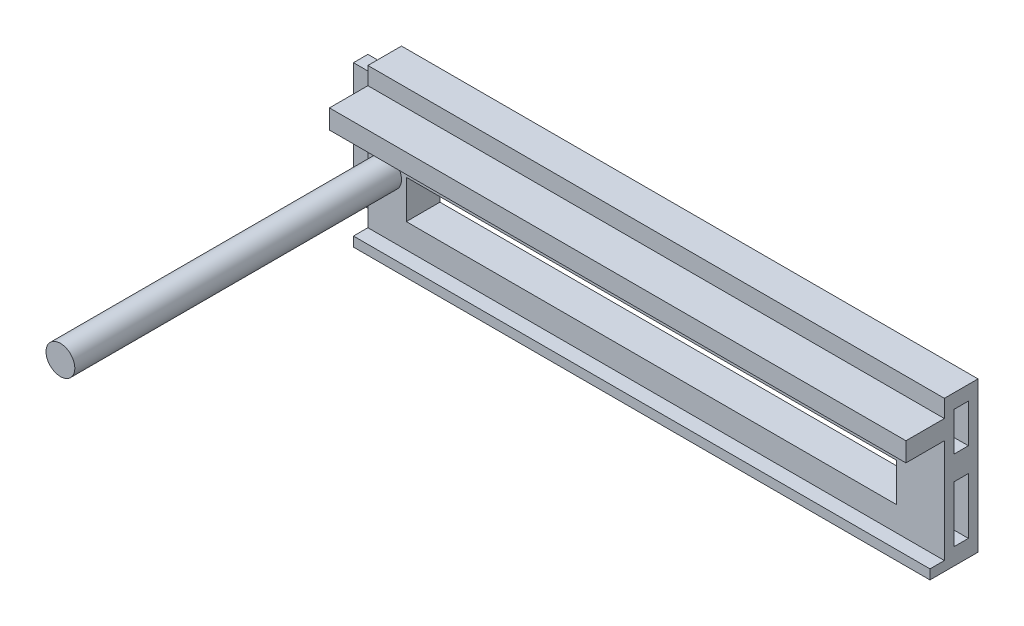
ISO-10303-21;
HEADER;
FILE_DESCRIPTION(('STEP AP214'),'2;1');
FILE_NAME('part.step','',(''),(''),'','','');
FILE_SCHEMA(('AUTOMOTIVE_DESIGN { 1 0 10303 214 1 1 1 1 }'));
ENDSEC;
DATA;
#1=APPLICATION_CONTEXT('core data for automotive mechanical design processes');
#2=APPLICATION_PROTOCOL_DEFINITION('international standard','automotive_design',2000,#1);
#3=PRODUCT_CONTEXT('',#1,'mechanical');
#4=PRODUCT('Part','Part','',(#3));
#5=PRODUCT_RELATED_PRODUCT_CATEGORY('part','',(#4));
#6=PRODUCT_DEFINITION_FORMATION('','',#4);
#7=PRODUCT_DEFINITION_CONTEXT('part definition',#1,'design');
#8=PRODUCT_DEFINITION('design','',#6,#7);
#9=PRODUCT_DEFINITION_SHAPE('','',#8);
#10=(LENGTH_UNIT() NAMED_UNIT(*) SI_UNIT(.MILLI.,.METRE.));
#11=(NAMED_UNIT(*) PLANE_ANGLE_UNIT() SI_UNIT($,.RADIAN.));
#12=(NAMED_UNIT(*) SI_UNIT($,.STERADIAN.) SOLID_ANGLE_UNIT());
#13=UNCERTAINTY_MEASURE_WITH_UNIT(LENGTH_MEASURE(1.E-05),#10,'distance_accuracy_value','');
#14=(GEOMETRIC_REPRESENTATION_CONTEXT(3) GLOBAL_UNCERTAINTY_ASSIGNED_CONTEXT((#13)) GLOBAL_UNIT_ASSIGNED_CONTEXT((#10,
#11,#12)) REPRESENTATION_CONTEXT('',''));
#15=CARTESIAN_POINT('',(0.,0.,0.));
#16=DIRECTION('',(0.,0.,1.));
#17=DIRECTION('',(1.,0.,0.));
#18=AXIS2_PLACEMENT_3D('',#15,#16,#17);
#19=CARTESIAN_POINT('',(0.,0.,7.));
#20=DIRECTION('',(1.,0.,0.));
#21=DIRECTION('',(0.,0.,-1.));
#22=AXIS2_PLACEMENT_3D('',#19,#20,#21);
#23=PLANE('',#22);
#24=DIRECTION('',(0.,-1.,0.));
#25=VECTOR('',#24,1.);
#26=CARTESIAN_POINT('',(0.,20.1593881752143,2.));
#27=LINE('',#26,#25);
#28=CARTESIAN_POINT('',(0.,28.25,2.));
#29=VERTEX_POINT('',#28);
#30=CARTESIAN_POINT('',(0.,20.1593881752143,2.));
#31=VERTEX_POINT('',#30);
#32=EDGE_CURVE('E466',#29,#31,#27,.T.);
#33=ORIENTED_EDGE('',*,*,#32,.F.);
#34=DIRECTION('',(0.,0.,-1.));
#35=VECTOR('',#34,1.);
#36=CARTESIAN_POINT('',(0.,28.25,2.));
#37=LINE('',#36,#35);
#38=CARTESIAN_POINT('',(0.,28.25,5.));
#39=VERTEX_POINT('',#38);
#40=EDGE_CURVE('E457',#39,#29,#37,.T.);
#41=ORIENTED_EDGE('',*,*,#40,.F.);
#42=DIRECTION('',(0.,1.,0.));
#43=VECTOR('',#42,1.);
#44=CARTESIAN_POINT('',(0.,20.1593881752143,5.));
#45=LINE('',#44,#43);
#46=CARTESIAN_POINT('',(0.,20.1593881752143,5.));
#47=VERTEX_POINT('',#46);
#48=EDGE_CURVE('E480',#47,#39,#45,.T.);
#49=ORIENTED_EDGE('',*,*,#48,.F.);
#50=DIRECTION('',(0.,0.,1.));
#51=VECTOR('',#50,1.);
#52=CARTESIAN_POINT('',(0.,20.1593881752143,2.));
#53=LINE('',#52,#51);
#54=EDGE_CURVE('E475',#31,#47,#53,.T.);
#55=ORIENTED_EDGE('',*,*,#54,.F.);
#56=EDGE_LOOP('',(#33,#41,#49,#55));
#57=FACE_BOUND('',#56,.T.);
#58=DIRECTION('',(0.,-1.,0.));
#59=VECTOR('',#58,1.);
#60=CARTESIAN_POINT('',(0.,3.5,2.));
#61=LINE('',#60,#59);
#62=CARTESIAN_POINT('',(0.,14.1593881752143,2.));
#63=VERTEX_POINT('',#62);
#64=CARTESIAN_POINT('',(0.,3.5,2.));
#65=VERTEX_POINT('',#64);
#66=EDGE_CURVE('E474',#63,#65,#61,.T.);
#67=ORIENTED_EDGE('',*,*,#66,.F.);
#68=DIRECTION('',(0.,0.,-1.));
#69=VECTOR('',#68,1.);
#70=CARTESIAN_POINT('',(0.,14.1593881752143,2.));
#71=LINE('',#70,#69);
#72=CARTESIAN_POINT('',(0.,14.1593881752143,5.));
#73=VERTEX_POINT('',#72);
#74=EDGE_CURVE('E517',#73,#63,#71,.T.);
#75=ORIENTED_EDGE('',*,*,#74,.F.);
#76=DIRECTION('',(0.,1.,0.));
#77=VECTOR('',#76,1.);
#78=CARTESIAN_POINT('',(0.,3.5,5.));
#79=LINE('',#78,#77);
#80=CARTESIAN_POINT('',(0.,3.5,5.));
#81=VERTEX_POINT('',#80);
#82=EDGE_CURVE('E518',#81,#73,#79,.T.);
#83=ORIENTED_EDGE('',*,*,#82,.F.);
#84=DIRECTION('',(0.,0.,1.));
#85=VECTOR('',#84,1.);
#86=CARTESIAN_POINT('',(0.,3.5,2.));
#87=LINE('',#86,#85);
#88=EDGE_CURVE('E524',#65,#81,#87,.T.);
#89=ORIENTED_EDGE('',*,*,#88,.F.);
#90=EDGE_LOOP('',(#67,#75,#83,#89));
#91=FACE_BOUND('',#90,.T.);
#92=DIRECTION('',(0.,-1.,0.));
#93=VECTOR('',#92,1.);
#94=CARTESIAN_POINT('',(0.,0.,10.));
#95=LINE('',#94,#93);
#96=CARTESIAN_POINT('',(0.,2.,10.));
#97=VERTEX_POINT('',#96);
#98=CARTESIAN_POINT('',(0.,0.,10.));
#99=VERTEX_POINT('',#98);
#100=EDGE_CURVE('E266',#97,#99,#95,.T.);
#101=ORIENTED_EDGE('',*,*,#100,.F.);
#102=DIRECTION('',(0.,0.,-1.));
#103=VECTOR('',#102,1.);
#104=CARTESIAN_POINT('',(0.,2.,15.));
#105=LINE('',#104,#103);
#106=CARTESIAN_POINT('',(0.,2.,7.));
#107=VERTEX_POINT('',#106);
#108=EDGE_CURVE('E276',#97,#107,#105,.T.);
#109=ORIENTED_EDGE('',*,*,#108,.T.);
#110=DIRECTION('',(0.,-1.,0.));
#111=VECTOR('',#110,1.);
#112=CARTESIAN_POINT('',(0.,0.,7.));
#113=LINE('',#112,#111);
#114=CARTESIAN_POINT('',(0.,23.6,7.));
#115=VERTEX_POINT('',#114);
#116=EDGE_CURVE('E303',#115,#107,#113,.T.);
#117=ORIENTED_EDGE('',*,*,#116,.F.);
#118=DIRECTION('',(0.,0.,-1.));
#119=VECTOR('',#118,1.);
#120=CARTESIAN_POINT('',(0.,23.6,15.));
#121=LINE('',#120,#119);
#122=CARTESIAN_POINT('',(0.,23.6,15.));
#123=VERTEX_POINT('',#122);
#124=EDGE_CURVE('E314',#123,#115,#121,.T.);
#125=ORIENTED_EDGE('',*,*,#124,.F.);
#126=DIRECTION('',(0.,-1.,0.));
#127=VECTOR('',#126,1.);
#128=CARTESIAN_POINT('',(0.,27.6,15.));
#129=LINE('',#128,#127);
#130=CARTESIAN_POINT('',(0.,27.6,15.));
#131=VERTEX_POINT('',#130);
#132=EDGE_CURVE('E629',#131,#123,#129,.T.);
#133=ORIENTED_EDGE('',*,*,#132,.F.);
#134=DIRECTION('',(0.,0.,-1.));
#135=VECTOR('',#134,1.);
#136=CARTESIAN_POINT('',(0.,27.6,15.));
#137=LINE('',#136,#135);
#138=CARTESIAN_POINT('',(0.,27.6,7.));
#139=VERTEX_POINT('',#138);
#140=EDGE_CURVE('E641',#131,#139,#137,.T.);
#141=ORIENTED_EDGE('',*,*,#140,.T.);
#142=CARTESIAN_POINT('',(0.,31.25,7.));
#143=VERTEX_POINT('',#142);
#144=EDGE_CURVE('E299',#143,#139,#113,.T.);
#145=ORIENTED_EDGE('',*,*,#144,.F.);
#146=DIRECTION('',(0.,0.,-1.));
#147=VECTOR('',#146,1.);
#148=CARTESIAN_POINT('',(0.,31.25,7.));
#149=LINE('',#148,#147);
#150=CARTESIAN_POINT('',(0.,31.25,0.));
#151=VERTEX_POINT('',#150);
#152=EDGE_CURVE('E309',#143,#151,#149,.T.);
#153=ORIENTED_EDGE('',*,*,#152,.T.);
#154=DIRECTION('',(0.,-1.,0.));
#155=VECTOR('',#154,1.);
#156=CARTESIAN_POINT('',(0.,0.,0.));
#157=LINE('',#156,#155);
#158=CARTESIAN_POINT('',(0.,0.,0.));
#159=VERTEX_POINT('',#158);
#160=EDGE_CURVE('E311',#151,#159,#157,.T.);
#161=ORIENTED_EDGE('',*,*,#160,.T.);
#162=DIRECTION('',(0.,0.,-1.));
#163=VECTOR('',#162,1.);
#164=CARTESIAN_POINT('',(0.,0.,7.));
#165=LINE('',#164,#163);
#166=EDGE_CURVE('E54',#99,#159,#165,.T.);
#167=ORIENTED_EDGE('',*,*,#166,.F.);
#168=EDGE_LOOP('',(#101,#109,#117,#125,#133,#141,#145,#153,#161,#167));
#169=FACE_BOUND('',#168,.T.);
#170=ADVANCED_FACE('F50',(#57,#91,#169),#23,.F.);
#171=CARTESIAN_POINT('',(120.,0.,7.));
#172=DIRECTION('',(-1.,0.,0.));
#173=DIRECTION('',(0.,0.,1.));
#174=AXIS2_PLACEMENT_3D('',#171,#172,#173);
#175=PLANE('',#174);
#176=DIRECTION('',(0.,0.,-1.));
#177=VECTOR('',#176,1.);
#178=CARTESIAN_POINT('',(120.,3.5,5.));
#179=LINE('',#178,#177);
#180=CARTESIAN_POINT('',(120.,3.5,5.));
#181=VERTEX_POINT('',#180);
#182=CARTESIAN_POINT('',(120.,3.5,2.));
#183=VERTEX_POINT('',#182);
#184=EDGE_CURVE('E433',#181,#183,#179,.T.);
#185=ORIENTED_EDGE('',*,*,#184,.F.);
#186=DIRECTION('',(0.,-1.,0.));
#187=VECTOR('',#186,1.);
#188=CARTESIAN_POINT('',(120.,3.5,5.));
#189=LINE('',#188,#187);
#190=CARTESIAN_POINT('',(120.,15.1919851003935,5.));
#191=VERTEX_POINT('',#190);
#192=EDGE_CURVE('E389',#191,#181,#189,.T.);
#193=ORIENTED_EDGE('',*,*,#192,.F.);
#194=DIRECTION('',(0.,0.,1.));
#195=VECTOR('',#194,1.);
#196=CARTESIAN_POINT('',(120.,15.1919851003935,5.));
#197=LINE('',#196,#195);
#198=CARTESIAN_POINT('',(120.,15.1919851003935,2.));
#199=VERTEX_POINT('',#198);
#200=EDGE_CURVE('E425',#199,#191,#197,.T.);
#201=ORIENTED_EDGE('',*,*,#200,.F.);
#202=DIRECTION('',(0.,1.,0.));
#203=VECTOR('',#202,1.);
#204=CARTESIAN_POINT('',(120.,3.5,2.));
#205=LINE('',#204,#203);
#206=EDGE_CURVE('E426',#183,#199,#205,.T.);
#207=ORIENTED_EDGE('',*,*,#206,.F.);
#208=EDGE_LOOP('',(#185,#193,#201,#207));
#209=FACE_BOUND('',#208,.T.);
#210=DIRECTION('',(0.,0.,-1.));
#211=VECTOR('',#210,1.);
#212=CARTESIAN_POINT('',(120.,20.1919851003935,5.));
#213=LINE('',#212,#211);
#214=CARTESIAN_POINT('',(120.,20.1919851003935,5.));
#215=VERTEX_POINT('',#214);
#216=CARTESIAN_POINT('',(120.,20.1919851003935,2.));
#217=VERTEX_POINT('',#216);
#218=EDGE_CURVE('E390',#215,#217,#213,.T.);
#219=ORIENTED_EDGE('',*,*,#218,.F.);
#220=DIRECTION('',(0.,-1.,0.));
#221=VECTOR('',#220,1.);
#222=CARTESIAN_POINT('',(120.,20.1919851003935,5.));
#223=LINE('',#222,#221);
#224=CARTESIAN_POINT('',(120.,28.25,5.));
#225=VERTEX_POINT('',#224);
#226=EDGE_CURVE('E69',#225,#215,#223,.T.);
#227=ORIENTED_EDGE('',*,*,#226,.F.);
#228=DIRECTION('',(0.,0.,1.));
#229=VECTOR('',#228,1.);
#230=CARTESIAN_POINT('',(120.,28.25,5.));
#231=LINE('',#230,#229);
#232=CARTESIAN_POINT('',(120.,28.25,2.));
#233=VERTEX_POINT('',#232);
#234=EDGE_CURVE('E375',#233,#225,#231,.T.);
#235=ORIENTED_EDGE('',*,*,#234,.F.);
#236=DIRECTION('',(0.,1.,0.));
#237=VECTOR('',#236,1.);
#238=CARTESIAN_POINT('',(120.,20.1919851003935,2.));
#239=LINE('',#238,#237);
#240=EDGE_CURVE('E395',#217,#233,#239,.T.);
#241=ORIENTED_EDGE('',*,*,#240,.F.);
#242=EDGE_LOOP('',(#219,#227,#235,#241));
#243=FACE_BOUND('',#242,.T.);
#244=DIRECTION('',(0.,1.,0.));
#245=VECTOR('',#244,1.);
#246=CARTESIAN_POINT('',(120.,0.,10.));
#247=LINE('',#246,#245);
#248=CARTESIAN_POINT('',(120.,0.,10.));
#249=VERTEX_POINT('',#248);
#250=CARTESIAN_POINT('',(120.,2.,10.));
#251=VERTEX_POINT('',#250);
#252=EDGE_CURVE('E65',#249,#251,#247,.T.);
#253=ORIENTED_EDGE('',*,*,#252,.F.);
#254=DIRECTION('',(0.,0.,-1.));
#255=VECTOR('',#254,1.);
#256=CARTESIAN_POINT('',(120.,0.,7.));
#257=LINE('',#256,#255);
#258=CARTESIAN_POINT('',(120.,0.,0.));
#259=VERTEX_POINT('',#258);
#260=EDGE_CURVE('E335',#249,#259,#257,.T.);
#261=ORIENTED_EDGE('',*,*,#260,.T.);
#262=DIRECTION('',(0.,1.,0.));
#263=VECTOR('',#262,1.);
#264=CARTESIAN_POINT('',(120.,0.,0.));
#265=LINE('',#264,#263);
#266=CARTESIAN_POINT('',(120.,31.25,0.));
#267=VERTEX_POINT('',#266);
#268=EDGE_CURVE('E316',#259,#267,#265,.T.);
#269=ORIENTED_EDGE('',*,*,#268,.T.);
#270=DIRECTION('',(0.,0.,-1.));
#271=VECTOR('',#270,1.);
#272=CARTESIAN_POINT('',(120.,31.25,7.));
#273=LINE('',#272,#271);
#274=CARTESIAN_POINT('',(120.,31.25,7.));
#275=VERTEX_POINT('',#274);
#276=EDGE_CURVE('E327',#275,#267,#273,.T.);
#277=ORIENTED_EDGE('',*,*,#276,.F.);
#278=DIRECTION('',(0.,1.,0.));
#279=VECTOR('',#278,1.);
#280=CARTESIAN_POINT('',(120.,0.,7.));
#281=LINE('',#280,#279);
#282=CARTESIAN_POINT('',(120.,27.6,7.));
#283=VERTEX_POINT('',#282);
#284=EDGE_CURVE('E305',#283,#275,#281,.T.);
#285=ORIENTED_EDGE('',*,*,#284,.F.);
#286=DIRECTION('',(0.,0.,-1.));
#287=VECTOR('',#286,1.);
#288=CARTESIAN_POINT('',(120.,27.6,15.));
#289=LINE('',#288,#287);
#290=CARTESIAN_POINT('',(120.,27.6,15.));
#291=VERTEX_POINT('',#290);
#292=EDGE_CURVE('E653',#291,#283,#289,.T.);
#293=ORIENTED_EDGE('',*,*,#292,.F.);
#294=DIRECTION('',(0.,1.,0.));
#295=VECTOR('',#294,1.);
#296=CARTESIAN_POINT('',(120.,27.6,15.));
#297=LINE('',#296,#295);
#298=CARTESIAN_POINT('',(120.,23.6,15.));
#299=VERTEX_POINT('',#298);
#300=EDGE_CURVE('E637',#299,#291,#297,.T.);
#301=ORIENTED_EDGE('',*,*,#300,.F.);
#302=DIRECTION('',(0.,0.,-1.));
#303=VECTOR('',#302,1.);
#304=CARTESIAN_POINT('',(120.,23.6,15.));
#305=LINE('',#304,#303);
#306=CARTESIAN_POINT('',(120.,23.6,7.));
#307=VERTEX_POINT('',#306);
#308=EDGE_CURVE('E660',#299,#307,#305,.T.);
#309=ORIENTED_EDGE('',*,*,#308,.T.);
#310=CARTESIAN_POINT('',(120.,2.,7.));
#311=VERTEX_POINT('',#310);
#312=EDGE_CURVE('E306',#311,#307,#281,.T.);
#313=ORIENTED_EDGE('',*,*,#312,.F.);
#314=DIRECTION('',(0.,0.,-1.));
#315=VECTOR('',#314,1.);
#316=CARTESIAN_POINT('',(120.,2.,15.));
#317=LINE('',#316,#315);
#318=EDGE_CURVE('E287',#251,#311,#317,.T.);
#319=ORIENTED_EDGE('',*,*,#318,.F.);
#320=EDGE_LOOP('',(#253,#261,#269,#277,#285,#293,#301,#309,#313,#319));
#321=FACE_BOUND('',#320,.T.);
#322=ADVANCED_FACE('F351',(#209,#243,#321),#175,.F.);
#323=CARTESIAN_POINT('',(0.,2.,15.));
#324=DIRECTION('',(0.,-1.,0.));
#325=DIRECTION('',(0.,0.,-1.));
#326=AXIS2_PLACEMENT_3D('',#323,#324,#325);
#327=PLANE('',#326);
#328=DIRECTION('',(-1.,0.,0.));
#329=VECTOR('',#328,1.);
#330=CARTESIAN_POINT('',(120.001,2.,10.));
#331=LINE('',#330,#329);
#332=EDGE_CURVE('E264',#251,#97,#331,.T.);
#333=ORIENTED_EDGE('',*,*,#332,.F.);
#334=ORIENTED_EDGE('',*,*,#318,.T.);
#335=DIRECTION('',(-1.,0.,0.));
#336=VECTOR('',#335,1.);
#337=CARTESIAN_POINT('',(0.,2.,7.));
#338=LINE('',#337,#336);
#339=EDGE_CURVE('E290',#311,#107,#338,.T.);
#340=ORIENTED_EDGE('',*,*,#339,.T.);
#341=ORIENTED_EDGE('',*,*,#108,.F.);
#342=EDGE_LOOP('',(#333,#334,#340,#341));
#343=FACE_BOUND('',#342,.T.);
#344=ADVANCED_FACE('F284',(#343),#327,.F.);
#345=CARTESIAN_POINT('',(0.,0.,7.));
#346=DIRECTION('',(0.,0.,-1.));
#347=DIRECTION('',(-1.,0.,0.));
#348=AXIS2_PLACEMENT_3D('',#345,#346,#347);
#349=PLANE('',#348);
#350=DIRECTION('',(-1.,0.,0.));
#351=VECTOR('',#350,1.);
#352=CARTESIAN_POINT('',(0.,27.6,7.));
#353=LINE('',#352,#351);
#354=EDGE_CURVE('E634',#283,#139,#353,.T.);
#355=ORIENTED_EDGE('',*,*,#354,.F.);
#356=ORIENTED_EDGE('',*,*,#284,.T.);
#357=DIRECTION('',(-1.,0.,0.));
#358=VECTOR('',#357,1.);
#359=CARTESIAN_POINT('',(0.,31.25,7.));
#360=LINE('',#359,#358);
#361=EDGE_CURVE('E310',#275,#143,#360,.T.);
#362=ORIENTED_EDGE('',*,*,#361,.T.);
#363=ORIENTED_EDGE('',*,*,#144,.T.);
#364=EDGE_LOOP('',(#355,#356,#362,#363));
#365=FACE_BOUND('',#364,.T.);
#366=ADVANCED_FACE('F768',(#365),#349,.F.);
#367=CARTESIAN_POINT('',(4.,14.1593881752143,7.00000000000001));
#368=DIRECTION('',(0.,0.,-1.));
#369=DIRECTION('',(-1.,0.,0.));
#370=AXIS2_PLACEMENT_3D('',#367,#368,#369);
#371=CIRCLE('',#370,3.);
#372=CARTESIAN_POINT('',(1.,14.1593881752143,7.00000000000001));
#373=VERTEX_POINT('',#372);
#374=EDGE_CURVE('E11',#373,#373,#371,.F.);
#375=ORIENTED_EDGE('',*,*,#374,.F.);
#376=EDGE_LOOP('',(#375));
#377=FACE_BOUND('',#376,.T.);
#378=DIRECTION('',(-1.,0.,0.));
#379=VECTOR('',#378,1.);
#380=CARTESIAN_POINT('',(0.,7.1,7.));
#381=LINE('',#380,#379);
#382=CARTESIAN_POINT('',(110.,7.1,7.));
#383=VERTEX_POINT('',#382);
#384=CARTESIAN_POINT('',(8.,7.1,7.));
#385=VERTEX_POINT('',#384);
#386=EDGE_CURVE('E614',#383,#385,#381,.T.);
#387=ORIENTED_EDGE('',*,*,#386,.T.);
#388=DIRECTION('',(0.,1.,0.));
#389=VECTOR('',#388,1.);
#390=CARTESIAN_POINT('',(8.,0.,7.));
#391=LINE('',#390,#389);
#392=CARTESIAN_POINT('',(8.,15.1,7.));
#393=VERTEX_POINT('',#392);
#394=EDGE_CURVE('E294',#385,#393,#391,.T.);
#395=ORIENTED_EDGE('',*,*,#394,.T.);
#396=DIRECTION('',(1.,0.,0.));
#397=VECTOR('',#396,1.);
#398=CARTESIAN_POINT('',(0.,15.1,7.));
#399=LINE('',#398,#397);
#400=CARTESIAN_POINT('',(110.,15.1,7.));
#401=VERTEX_POINT('',#400);
#402=EDGE_CURVE('E621',#393,#401,#399,.T.);
#403=ORIENTED_EDGE('',*,*,#402,.T.);
#404=DIRECTION('',(0.,-1.,0.));
#405=VECTOR('',#404,1.);
#406=CARTESIAN_POINT('',(110.,0.,7.));
#407=LINE('',#406,#405);
#408=EDGE_CURVE('E620',#401,#383,#407,.T.);
#409=ORIENTED_EDGE('',*,*,#408,.T.);
#410=EDGE_LOOP('',(#387,#395,#403,#409));
#411=FACE_BOUND('',#410,.T.);
#412=DIRECTION('',(-1.,0.,0.));
#413=VECTOR('',#412,1.);
#414=CARTESIAN_POINT('',(0.,20.1,7.));
#415=LINE('',#414,#413);
#416=CARTESIAN_POINT('',(110.,20.1,7.));
#417=VERTEX_POINT('',#416);
#418=CARTESIAN_POINT('',(8.,20.1,7.));
#419=VERTEX_POINT('',#418);
#420=EDGE_CURVE('E564',#417,#419,#415,.T.);
#421=ORIENTED_EDGE('',*,*,#420,.T.);
#422=DIRECTION('',(0.,1.,0.));
#423=VECTOR('',#422,1.);
#424=CARTESIAN_POINT('',(8.,0.,7.));
#425=LINE('',#424,#423);
#426=CARTESIAN_POINT('',(8.,23.6,7.));
#427=VERTEX_POINT('',#426);
#428=EDGE_CURVE('E613',#419,#427,#425,.T.);
#429=ORIENTED_EDGE('',*,*,#428,.T.);
#430=DIRECTION('',(1.,0.,0.));
#431=VECTOR('',#430,1.);
#432=CARTESIAN_POINT('',(0.,23.6,7.));
#433=LINE('',#432,#431);
#434=EDGE_CURVE('E643',#115,#427,#433,.T.);
#435=ORIENTED_EDGE('',*,*,#434,.F.);
#436=ORIENTED_EDGE('',*,*,#116,.T.);
#437=ORIENTED_EDGE('',*,*,#339,.F.);
#438=ORIENTED_EDGE('',*,*,#312,.T.);
#439=CARTESIAN_POINT('',(110.,23.6,7.));
#440=VERTEX_POINT('',#439);
#441=EDGE_CURVE('E291',#440,#307,#433,.T.);
#442=ORIENTED_EDGE('',*,*,#441,.F.);
#443=DIRECTION('',(0.,-1.,0.));
#444=VECTOR('',#443,1.);
#445=CARTESIAN_POINT('',(110.,0.,7.));
#446=LINE('',#445,#444);
#447=EDGE_CURVE('E610',#440,#417,#446,.T.);
#448=ORIENTED_EDGE('',*,*,#447,.T.);
#449=EDGE_LOOP('',(#421,#429,#435,#436,#437,#438,#442,#448));
#450=FACE_BOUND('',#449,.T.);
#451=ADVANCED_FACE('F675',(#377,#411,#450),#349,.F.);
#452=CARTESIAN_POINT('',(0.,0.,7.));
#453=DIRECTION('',(0.,1.,0.));
#454=DIRECTION('',(0.,0.,1.));
#455=AXIS2_PLACEMENT_3D('',#452,#453,#454);
#456=PLANE('',#455);
#457=ORIENTED_EDGE('',*,*,#260,.F.);
#458=DIRECTION('',(-1.,0.,0.));
#459=VECTOR('',#458,1.);
#460=CARTESIAN_POINT('',(120.001,0.,10.));
#461=LINE('',#460,#459);
#462=EDGE_CURVE('E274',#249,#99,#461,.T.);
#463=ORIENTED_EDGE('',*,*,#462,.T.);
#464=ORIENTED_EDGE('',*,*,#166,.T.);
#465=DIRECTION('',(1.,0.,0.));
#466=VECTOR('',#465,1.);
#467=CARTESIAN_POINT('',(0.,0.,0.));
#468=LINE('',#467,#466);
#469=EDGE_CURVE('E313',#159,#259,#468,.T.);
#470=ORIENTED_EDGE('',*,*,#469,.T.);
#471=EDGE_LOOP('',(#457,#463,#464,#470));
#472=FACE_BOUND('',#471,.T.);
#473=ADVANCED_FACE('F336',(#472),#456,.F.);
#474=CARTESIAN_POINT('',(0.,31.25,7.));
#475=DIRECTION('',(0.,-1.,0.));
#476=DIRECTION('',(0.,0.,-1.));
#477=AXIS2_PLACEMENT_3D('',#474,#475,#476);
#478=PLANE('',#477);
#479=DIRECTION('',(-1.,0.,0.));
#480=VECTOR('',#479,1.);
#481=CARTESIAN_POINT('',(0.,31.25,0.));
#482=LINE('',#481,#480);
#483=EDGE_CURVE('E325',#267,#151,#482,.T.);
#484=ORIENTED_EDGE('',*,*,#483,.T.);
#485=ORIENTED_EDGE('',*,*,#152,.F.);
#486=ORIENTED_EDGE('',*,*,#361,.F.);
#487=ORIENTED_EDGE('',*,*,#276,.T.);
#488=EDGE_LOOP('',(#484,#485,#486,#487));
#489=FACE_BOUND('',#488,.T.);
#490=ADVANCED_FACE('F348',(#489),#478,.F.);
#491=CARTESIAN_POINT('',(0.,0.,0.));
#492=DIRECTION('',(0.,0.,-1.));
#493=DIRECTION('',(-1.,0.,0.));
#494=AXIS2_PLACEMENT_3D('',#491,#492,#493);
#495=PLANE('',#494);
#496=DIRECTION('',(0.,-1.,0.));
#497=VECTOR('',#496,1.);
#498=CARTESIAN_POINT('',(8.,7.1,0.));
#499=LINE('',#498,#497);
#500=CARTESIAN_POINT('',(8.,15.1,0.));
#501=VERTEX_POINT('',#500);
#502=CARTESIAN_POINT('',(8.,7.1,0.));
#503=VERTEX_POINT('',#502);
#504=EDGE_CURVE('E542',#501,#503,#499,.T.);
#505=ORIENTED_EDGE('',*,*,#504,.T.);
#506=DIRECTION('',(1.,0.,0.));
#507=VECTOR('',#506,1.);
#508=CARTESIAN_POINT('',(8.,7.1,0.));
#509=LINE('',#508,#507);
#510=CARTESIAN_POINT('',(110.,7.1,0.));
#511=VERTEX_POINT('',#510);
#512=EDGE_CURVE('E550',#503,#511,#509,.T.);
#513=ORIENTED_EDGE('',*,*,#512,.T.);
#514=DIRECTION('',(0.,1.,0.));
#515=VECTOR('',#514,1.);
#516=CARTESIAN_POINT('',(110.,7.1,0.));
#517=LINE('',#516,#515);
#518=CARTESIAN_POINT('',(110.,15.1,0.));
#519=VERTEX_POINT('',#518);
#520=EDGE_CURVE('E552',#511,#519,#517,.T.);
#521=ORIENTED_EDGE('',*,*,#520,.T.);
#522=DIRECTION('',(-1.,0.,0.));
#523=VECTOR('',#522,1.);
#524=CARTESIAN_POINT('',(8.,15.1,0.));
#525=LINE('',#524,#523);
#526=EDGE_CURVE('E558',#519,#501,#525,.T.);
#527=ORIENTED_EDGE('',*,*,#526,.T.);
#528=EDGE_LOOP('',(#505,#513,#521,#527));
#529=FACE_BOUND('',#528,.T.);
#530=DIRECTION('',(0.,-1.,0.));
#531=VECTOR('',#530,1.);
#532=CARTESIAN_POINT('',(8.,20.1,0.));
#533=LINE('',#532,#531);
#534=CARTESIAN_POINT('',(8.,23.6,0.));
#535=VERTEX_POINT('',#534);
#536=CARTESIAN_POINT('',(8.,20.1,0.));
#537=VERTEX_POINT('',#536);
#538=EDGE_CURVE('E546',#535,#537,#533,.T.);
#539=ORIENTED_EDGE('',*,*,#538,.T.);
#540=DIRECTION('',(1.,0.,0.));
#541=VECTOR('',#540,1.);
#542=CARTESIAN_POINT('',(8.,20.1,0.));
#543=LINE('',#542,#541);
#544=CARTESIAN_POINT('',(110.,20.1,0.));
#545=VERTEX_POINT('',#544);
#546=EDGE_CURVE('E600',#537,#545,#543,.T.);
#547=ORIENTED_EDGE('',*,*,#546,.T.);
#548=DIRECTION('',(0.,1.,0.));
#549=VECTOR('',#548,1.);
#550=CARTESIAN_POINT('',(110.,20.1,0.));
#551=LINE('',#550,#549);
#552=CARTESIAN_POINT('',(110.,23.6,0.));
#553=VERTEX_POINT('',#552);
#554=EDGE_CURVE('E591',#545,#553,#551,.T.);
#555=ORIENTED_EDGE('',*,*,#554,.T.);
#556=DIRECTION('',(-1.,0.,0.));
#557=VECTOR('',#556,1.);
#558=CARTESIAN_POINT('',(8.,23.6,0.));
#559=LINE('',#558,#557);
#560=EDGE_CURVE('E576',#553,#535,#559,.T.);
#561=ORIENTED_EDGE('',*,*,#560,.T.);
#562=EDGE_LOOP('',(#539,#547,#555,#561));
#563=FACE_BOUND('',#562,.T.);
#564=ORIENTED_EDGE('',*,*,#160,.F.);
#565=ORIENTED_EDGE('',*,*,#483,.F.);
#566=ORIENTED_EDGE('',*,*,#268,.F.);
#567=ORIENTED_EDGE('',*,*,#469,.F.);
#568=EDGE_LOOP('',(#564,#565,#566,#567));
#569=FACE_BOUND('',#568,.T.);
#570=ADVANCED_FACE('F345',(#529,#563,#569),#495,.T.);
#571=CARTESIAN_POINT('',(0.,23.6,15.));
#572=DIRECTION('',(0.,1.,0.));
#573=DIRECTION('',(0.,0.,1.));
#574=AXIS2_PLACEMENT_3D('',#571,#572,#573);
#575=PLANE('',#574);
#576=ORIENTED_EDGE('',*,*,#434,.T.);
#577=DIRECTION('',(0.,0.,1.));
#578=VECTOR('',#577,1.);
#579=CARTESIAN_POINT('',(8.,23.6,0.));
#580=LINE('',#579,#578);
#581=EDGE_CURVE('E497',#535,#427,#580,.T.);
#582=ORIENTED_EDGE('',*,*,#581,.F.);
#583=ORIENTED_EDGE('',*,*,#560,.F.);
#584=DIRECTION('',(0.,0.,1.));
#585=VECTOR('',#584,1.);
#586=CARTESIAN_POINT('',(110.,23.6,0.));
#587=LINE('',#586,#585);
#588=EDGE_CURVE('E581',#553,#440,#587,.T.);
#589=ORIENTED_EDGE('',*,*,#588,.T.);
#590=ORIENTED_EDGE('',*,*,#441,.T.);
#591=ORIENTED_EDGE('',*,*,#308,.F.);
#592=DIRECTION('',(1.,0.,0.));
#593=VECTOR('',#592,1.);
#594=CARTESIAN_POINT('',(0.,23.6,15.));
#595=LINE('',#594,#593);
#596=EDGE_CURVE('E632',#123,#299,#595,.T.);
#597=ORIENTED_EDGE('',*,*,#596,.F.);
#598=ORIENTED_EDGE('',*,*,#124,.T.);
#599=EDGE_LOOP('',(#576,#582,#583,#589,#590,#591,#597,#598));
#600=FACE_BOUND('',#599,.T.);
#601=ADVANCED_FACE('F664',(#600),#575,.F.);
#602=CARTESIAN_POINT('',(0.,27.6,15.));
#603=DIRECTION('',(0.,-1.,0.));
#604=DIRECTION('',(0.,0.,-1.));
#605=AXIS2_PLACEMENT_3D('',#602,#603,#604);
#606=PLANE('',#605);
#607=ORIENTED_EDGE('',*,*,#354,.T.);
#608=ORIENTED_EDGE('',*,*,#140,.F.);
#609=DIRECTION('',(-1.,0.,0.));
#610=VECTOR('',#609,1.);
#611=CARTESIAN_POINT('',(0.,27.6,15.));
#612=LINE('',#611,#610);
#613=EDGE_CURVE('E642',#291,#131,#612,.T.);
#614=ORIENTED_EDGE('',*,*,#613,.F.);
#615=ORIENTED_EDGE('',*,*,#292,.T.);
#616=EDGE_LOOP('',(#607,#608,#614,#615));
#617=FACE_BOUND('',#616,.T.);
#618=ADVANCED_FACE('F692',(#617),#606,.F.);
#619=CARTESIAN_POINT('',(0.,0.,15.));
#620=DIRECTION('',(0.,0.,1.));
#621=DIRECTION('',(1.,0.,0.));
#622=AXIS2_PLACEMENT_3D('',#619,#620,#621);
#623=PLANE('',#622);
#624=ORIENTED_EDGE('',*,*,#132,.T.);
#625=ORIENTED_EDGE('',*,*,#596,.T.);
#626=ORIENTED_EDGE('',*,*,#300,.T.);
#627=ORIENTED_EDGE('',*,*,#613,.T.);
#628=EDGE_LOOP('',(#624,#625,#626,#627));
#629=FACE_BOUND('',#628,.T.);
#630=ADVANCED_FACE('F758',(#629),#623,.T.);
#631=CARTESIAN_POINT('',(8.,20.1,0.));
#632=DIRECTION('',(-1.,0.,0.));
#633=DIRECTION('',(0.,0.,1.));
#634=AXIS2_PLACEMENT_3D('',#631,#632,#633);
#635=PLANE('',#634);
#636=DIRECTION('',(0.,0.,1.));
#637=VECTOR('',#636,1.);
#638=CARTESIAN_POINT('',(8.,20.1,0.));
#639=LINE('',#638,#637);
#640=EDGE_CURVE('E577',#537,#419,#639,.T.);
#641=ORIENTED_EDGE('',*,*,#640,.F.);
#642=ORIENTED_EDGE('',*,*,#538,.F.);
#643=ORIENTED_EDGE('',*,*,#581,.T.);
#644=ORIENTED_EDGE('',*,*,#428,.F.);
#645=EDGE_LOOP('',(#641,#642,#643,#644));
#646=FACE_BOUND('',#645,.T.);
#647=ADVANCED_FACE('F684',(#646),#635,.F.);
#648=CARTESIAN_POINT('',(110.,20.1,0.));
#649=DIRECTION('',(1.,0.,0.));
#650=DIRECTION('',(0.,0.,-1.));
#651=AXIS2_PLACEMENT_3D('',#648,#649,#650);
#652=PLANE('',#651);
#653=ORIENTED_EDGE('',*,*,#588,.F.);
#654=ORIENTED_EDGE('',*,*,#554,.F.);
#655=DIRECTION('',(0.,0.,1.));
#656=VECTOR('',#655,1.);
#657=CARTESIAN_POINT('',(110.,20.1,0.));
#658=LINE('',#657,#656);
#659=EDGE_CURVE('E578',#545,#417,#658,.T.);
#660=ORIENTED_EDGE('',*,*,#659,.T.);
#661=ORIENTED_EDGE('',*,*,#447,.F.);
#662=EDGE_LOOP('',(#653,#654,#660,#661));
#663=FACE_BOUND('',#662,.T.);
#664=ADVANCED_FACE('F680',(#663),#652,.F.);
#665=CARTESIAN_POINT('',(8.,20.1,0.));
#666=DIRECTION('',(0.,-1.,0.));
#667=DIRECTION('',(0.,0.,-1.));
#668=AXIS2_PLACEMENT_3D('',#665,#666,#667);
#669=PLANE('',#668);
#670=ORIENTED_EDGE('',*,*,#659,.F.);
#671=ORIENTED_EDGE('',*,*,#546,.F.);
#672=ORIENTED_EDGE('',*,*,#640,.T.);
#673=ORIENTED_EDGE('',*,*,#420,.F.);
#674=EDGE_LOOP('',(#670,#671,#672,#673));
#675=FACE_BOUND('',#674,.T.);
#676=ADVANCED_FACE('F683',(#675),#669,.F.);
#677=CARTESIAN_POINT('',(8.,7.1,0.));
#678=DIRECTION('',(-1.,0.,0.));
#679=DIRECTION('',(0.,0.,1.));
#680=AXIS2_PLACEMENT_3D('',#677,#678,#679);
#681=PLANE('',#680);
#682=DIRECTION('',(0.,0.,1.));
#683=VECTOR('',#682,1.);
#684=CARTESIAN_POINT('',(8.,7.1,0.));
#685=LINE('',#684,#683);
#686=EDGE_CURVE('E557',#503,#385,#685,.T.);
#687=ORIENTED_EDGE('',*,*,#686,.F.);
#688=ORIENTED_EDGE('',*,*,#504,.F.);
#689=DIRECTION('',(0.,0.,1.));
#690=VECTOR('',#689,1.);
#691=CARTESIAN_POINT('',(8.,15.1,0.));
#692=LINE('',#691,#690);
#693=EDGE_CURVE('E561',#501,#393,#692,.T.);
#694=ORIENTED_EDGE('',*,*,#693,.T.);
#695=ORIENTED_EDGE('',*,*,#394,.F.);
#696=EDGE_LOOP('',(#687,#688,#694,#695));
#697=FACE_BOUND('',#696,.T.);
#698=ADVANCED_FACE('F744',(#697),#681,.F.);
#699=CARTESIAN_POINT('',(8.,15.1,0.));
#700=DIRECTION('',(0.,1.,0.));
#701=DIRECTION('',(0.,0.,1.));
#702=AXIS2_PLACEMENT_3D('',#699,#700,#701);
#703=PLANE('',#702);
#704=ORIENTED_EDGE('',*,*,#693,.F.);
#705=ORIENTED_EDGE('',*,*,#526,.F.);
#706=DIRECTION('',(0.,0.,1.));
#707=VECTOR('',#706,1.);
#708=CARTESIAN_POINT('',(110.,15.1,0.));
#709=LINE('',#708,#707);
#710=EDGE_CURVE('E566',#519,#401,#709,.T.);
#711=ORIENTED_EDGE('',*,*,#710,.T.);
#712=ORIENTED_EDGE('',*,*,#402,.F.);
#713=EDGE_LOOP('',(#704,#705,#711,#712));
#714=FACE_BOUND('',#713,.T.);
#715=ADVANCED_FACE('F743',(#714),#703,.F.);
#716=CARTESIAN_POINT('',(110.,7.1,0.));
#717=DIRECTION('',(1.,0.,0.));
#718=DIRECTION('',(0.,0.,-1.));
#719=AXIS2_PLACEMENT_3D('',#716,#717,#718);
#720=PLANE('',#719);
#721=ORIENTED_EDGE('',*,*,#710,.F.);
#722=ORIENTED_EDGE('',*,*,#520,.F.);
#723=DIRECTION('',(0.,0.,1.));
#724=VECTOR('',#723,1.);
#725=CARTESIAN_POINT('',(110.,7.1,0.));
#726=LINE('',#725,#724);
#727=EDGE_CURVE('E569',#511,#383,#726,.T.);
#728=ORIENTED_EDGE('',*,*,#727,.T.);
#729=ORIENTED_EDGE('',*,*,#408,.F.);
#730=EDGE_LOOP('',(#721,#722,#728,#729));
#731=FACE_BOUND('',#730,.T.);
#732=ADVANCED_FACE('F742',(#731),#720,.F.);
#733=CARTESIAN_POINT('',(8.,7.1,0.));
#734=DIRECTION('',(0.,-1.,0.));
#735=DIRECTION('',(0.,0.,-1.));
#736=AXIS2_PLACEMENT_3D('',#733,#734,#735);
#737=PLANE('',#736);
#738=ORIENTED_EDGE('',*,*,#727,.F.);
#739=ORIENTED_EDGE('',*,*,#512,.F.);
#740=ORIENTED_EDGE('',*,*,#686,.T.);
#741=ORIENTED_EDGE('',*,*,#386,.F.);
#742=EDGE_LOOP('',(#738,#739,#740,#741));
#743=FACE_BOUND('',#742,.T.);
#744=ADVANCED_FACE('F735',(#743),#737,.F.);
#745=CARTESIAN_POINT('',(-5.,3.5,2.));
#746=DIRECTION('',(0.,0.,1.));
#747=DIRECTION('',(1.,0.,0.));
#748=AXIS2_PLACEMENT_3D('',#745,#746,#747);
#749=PLANE('',#748);
#750=ORIENTED_EDGE('',*,*,#66,.T.);
#751=DIRECTION('',(1.,0.,0.));
#752=VECTOR('',#751,1.);
#753=CARTESIAN_POINT('',(-5.,3.5,2.));
#754=LINE('',#753,#752);
#755=CARTESIAN_POINT('',(-5.,3.5,2.));
#756=VERTEX_POINT('',#755);
#757=EDGE_CURVE('E405',#756,#65,#754,.T.);
#758=ORIENTED_EDGE('',*,*,#757,.F.);
#759=DIRECTION('',(0.,-1.,0.));
#760=VECTOR('',#759,1.);
#761=CARTESIAN_POINT('',(-5.,3.5,2.));
#762=LINE('',#761,#760);
#763=CARTESIAN_POINT('',(-5.,14.1593881752143,2.));
#764=VERTEX_POINT('',#763);
#765=EDGE_CURVE('E521',#764,#756,#762,.T.);
#766=ORIENTED_EDGE('',*,*,#765,.F.);
#767=DIRECTION('',(1.,0.,0.));
#768=VECTOR('',#767,1.);
#769=CARTESIAN_POINT('',(-5.,14.1593881752143,2.));
#770=LINE('',#769,#768);
#771=EDGE_CURVE('E512',#764,#63,#770,.T.);
#772=ORIENTED_EDGE('',*,*,#771,.T.);
#773=EDGE_LOOP('',(#750,#758,#766,#772));
#774=FACE_BOUND('',#773,.T.);
#775=ADVANCED_FACE('F716',(#774),#749,.F.);
#776=CARTESIAN_POINT('',(-5.,3.5,2.));
#777=DIRECTION('',(0.,1.,0.));
#778=DIRECTION('',(0.,0.,1.));
#779=AXIS2_PLACEMENT_3D('',#776,#777,#778);
#780=PLANE('',#779);
#781=ORIENTED_EDGE('',*,*,#88,.T.);
#782=DIRECTION('',(1.,0.,0.));
#783=VECTOR('',#782,1.);
#784=CARTESIAN_POINT('',(-5.,3.5,5.));
#785=LINE('',#784,#783);
#786=CARTESIAN_POINT('',(-5.,3.5,5.));
#787=VERTEX_POINT('',#786);
#788=EDGE_CURVE('E503',#787,#81,#785,.T.);
#789=ORIENTED_EDGE('',*,*,#788,.F.);
#790=DIRECTION('',(0.,0.,1.));
#791=VECTOR('',#790,1.);
#792=CARTESIAN_POINT('',(-5.,3.5,2.));
#793=LINE('',#792,#791);
#794=EDGE_CURVE('E540',#756,#787,#793,.T.);
#795=ORIENTED_EDGE('',*,*,#794,.F.);
#796=ORIENTED_EDGE('',*,*,#757,.T.);
#797=EDGE_LOOP('',(#781,#789,#795,#796));
#798=FACE_BOUND('',#797,.T.);
#799=ADVANCED_FACE('F722',(#798),#780,.F.);
#800=CARTESIAN_POINT('',(-5.,3.5,5.));
#801=DIRECTION('',(0.,0.,-1.));
#802=DIRECTION('',(-1.,0.,0.));
#803=AXIS2_PLACEMENT_3D('',#800,#801,#802);
#804=PLANE('',#803);
#805=ORIENTED_EDGE('',*,*,#82,.T.);
#806=DIRECTION('',(1.,0.,0.));
#807=VECTOR('',#806,1.);
#808=CARTESIAN_POINT('',(-5.,14.1593881752143,5.));
#809=LINE('',#808,#807);
#810=CARTESIAN_POINT('',(-5.,14.1593881752143,5.));
#811=VERTEX_POINT('',#810);
#812=EDGE_CURVE('E510',#811,#73,#809,.T.);
#813=ORIENTED_EDGE('',*,*,#812,.F.);
#814=DIRECTION('',(0.,1.,0.));
#815=VECTOR('',#814,1.);
#816=CARTESIAN_POINT('',(-5.,3.5,5.));
#817=LINE('',#816,#815);
#818=EDGE_CURVE('E534',#787,#811,#817,.T.);
#819=ORIENTED_EDGE('',*,*,#818,.F.);
#820=ORIENTED_EDGE('',*,*,#788,.T.);
#821=EDGE_LOOP('',(#805,#813,#819,#820));
#822=FACE_BOUND('',#821,.T.);
#823=ADVANCED_FACE('F725',(#822),#804,.F.);
#824=CARTESIAN_POINT('',(-5.,14.1593881752143,2.));
#825=DIRECTION('',(0.,-1.,0.));
#826=DIRECTION('',(0.,0.,-1.));
#827=AXIS2_PLACEMENT_3D('',#824,#825,#826);
#828=PLANE('',#827);
#829=ORIENTED_EDGE('',*,*,#74,.T.);
#830=ORIENTED_EDGE('',*,*,#771,.F.);
#831=DIRECTION('',(0.,0.,-1.));
#832=VECTOR('',#831,1.);
#833=CARTESIAN_POINT('',(-5.,14.1593881752143,2.));
#834=LINE('',#833,#832);
#835=EDGE_CURVE('E513',#811,#764,#834,.T.);
#836=ORIENTED_EDGE('',*,*,#835,.F.);
#837=ORIENTED_EDGE('',*,*,#812,.T.);
#838=EDGE_LOOP('',(#829,#830,#836,#837));
#839=FACE_BOUND('',#838,.T.);
#840=ADVANCED_FACE('F715',(#839),#828,.F.);
#841=CARTESIAN_POINT('',(-5.,0.,0.));
#842=DIRECTION('',(1.,0.,0.));
#843=DIRECTION('',(0.,0.,-1.));
#844=AXIS2_PLACEMENT_3D('',#841,#842,#843);
#845=PLANE('',#844);
#846=ORIENTED_EDGE('',*,*,#765,.T.);
#847=ORIENTED_EDGE('',*,*,#794,.T.);
#848=ORIENTED_EDGE('',*,*,#818,.T.);
#849=ORIENTED_EDGE('',*,*,#835,.T.);
#850=EDGE_LOOP('',(#846,#847,#848,#849));
#851=FACE_BOUND('',#850,.T.);
#852=ADVANCED_FACE('F717',(#851),#845,.F.);
#853=CARTESIAN_POINT('',(-5.,20.1593881752143,2.));
#854=DIRECTION('',(0.,0.,1.));
#855=DIRECTION('',(1.,0.,0.));
#856=AXIS2_PLACEMENT_3D('',#853,#854,#855);
#857=PLANE('',#856);
#858=ORIENTED_EDGE('',*,*,#32,.T.);
#859=DIRECTION('',(1.,0.,0.));
#860=VECTOR('',#859,1.);
#861=CARTESIAN_POINT('',(-5.,20.1593881752143,2.));
#862=LINE('',#861,#860);
#863=CARTESIAN_POINT('',(-5.,20.1593881752143,2.));
#864=VERTEX_POINT('',#863);
#865=EDGE_CURVE('E492',#864,#31,#862,.T.);
#866=ORIENTED_EDGE('',*,*,#865,.F.);
#867=DIRECTION('',(0.,-1.,0.));
#868=VECTOR('',#867,1.);
#869=CARTESIAN_POINT('',(-5.,20.1593881752143,2.));
#870=LINE('',#869,#868);
#871=CARTESIAN_POINT('',(-5.,28.25,2.));
#872=VERTEX_POINT('',#871);
#873=EDGE_CURVE('E454',#872,#864,#870,.T.);
#874=ORIENTED_EDGE('',*,*,#873,.F.);
#875=DIRECTION('',(1.,0.,0.));
#876=VECTOR('',#875,1.);
#877=CARTESIAN_POINT('',(-5.,28.25,2.));
#878=LINE('',#877,#876);
#879=EDGE_CURVE('E470',#872,#29,#878,.T.);
#880=ORIENTED_EDGE('',*,*,#879,.T.);
#881=EDGE_LOOP('',(#858,#866,#874,#880));
#882=FACE_BOUND('',#881,.T.);
#883=ADVANCED_FACE('F739',(#882),#857,.F.);
#884=CARTESIAN_POINT('',(-5.,20.1593881752143,2.));
#885=DIRECTION('',(0.,1.,0.));
#886=DIRECTION('',(0.,0.,1.));
#887=AXIS2_PLACEMENT_3D('',#884,#885,#886);
#888=PLANE('',#887);
#889=ORIENTED_EDGE('',*,*,#54,.T.);
#890=DIRECTION('',(1.,0.,0.));
#891=VECTOR('',#890,1.);
#892=CARTESIAN_POINT('',(-5.,20.1593881752143,5.));
#893=LINE('',#892,#891);
#894=CARTESIAN_POINT('',(-5.,20.1593881752143,5.));
#895=VERTEX_POINT('',#894);
#896=EDGE_CURVE('E493',#895,#47,#893,.T.);
#897=ORIENTED_EDGE('',*,*,#896,.F.);
#898=DIRECTION('',(0.,0.,1.));
#899=VECTOR('',#898,1.);
#900=CARTESIAN_POINT('',(-5.,20.1593881752143,2.));
#901=LINE('',#900,#899);
#902=EDGE_CURVE('E460',#864,#895,#901,.T.);
#903=ORIENTED_EDGE('',*,*,#902,.F.);
#904=ORIENTED_EDGE('',*,*,#865,.T.);
#905=EDGE_LOOP('',(#889,#897,#903,#904));
#906=FACE_BOUND('',#905,.T.);
#907=ADVANCED_FACE('F855',(#906),#888,.F.);
#908=CARTESIAN_POINT('',(-5.,20.1593881752143,5.));
#909=DIRECTION('',(0.,0.,-1.));
#910=DIRECTION('',(-1.,0.,0.));
#911=AXIS2_PLACEMENT_3D('',#908,#909,#910);
#912=PLANE('',#911);
#913=ORIENTED_EDGE('',*,*,#48,.T.);
#914=DIRECTION('',(1.,0.,0.));
#915=VECTOR('',#914,1.);
#916=CARTESIAN_POINT('',(-5.,28.25,5.));
#917=LINE('',#916,#915);
#918=CARTESIAN_POINT('',(-5.,28.25,5.));
#919=VERTEX_POINT('',#918);
#920=EDGE_CURVE('E487',#919,#39,#917,.T.);
#921=ORIENTED_EDGE('',*,*,#920,.F.);
#922=DIRECTION('',(0.,1.,0.));
#923=VECTOR('',#922,1.);
#924=CARTESIAN_POINT('',(-5.,20.1593881752143,5.));
#925=LINE('',#924,#923);
#926=EDGE_CURVE('E463',#895,#919,#925,.T.);
#927=ORIENTED_EDGE('',*,*,#926,.F.);
#928=ORIENTED_EDGE('',*,*,#896,.T.);
#929=EDGE_LOOP('',(#913,#921,#927,#928));
#930=FACE_BOUND('',#929,.T.);
#931=ADVANCED_FACE('F847',(#930),#912,.F.);
#932=CARTESIAN_POINT('',(-5.,28.25,2.));
#933=DIRECTION('',(0.,-1.,0.));
#934=DIRECTION('',(0.,0.,-1.));
#935=AXIS2_PLACEMENT_3D('',#932,#933,#934);
#936=PLANE('',#935);
#937=ORIENTED_EDGE('',*,*,#40,.T.);
#938=ORIENTED_EDGE('',*,*,#879,.F.);
#939=DIRECTION('',(0.,0.,-1.));
#940=VECTOR('',#939,1.);
#941=CARTESIAN_POINT('',(-5.,28.25,2.));
#942=LINE('',#941,#940);
#943=EDGE_CURVE('E462',#919,#872,#942,.T.);
#944=ORIENTED_EDGE('',*,*,#943,.F.);
#945=ORIENTED_EDGE('',*,*,#920,.T.);
#946=EDGE_LOOP('',(#937,#938,#944,#945));
#947=FACE_BOUND('',#946,.T.);
#948=ADVANCED_FACE('F841',(#947),#936,.F.);
#949=CARTESIAN_POINT('',(-5.,0.,0.));
#950=DIRECTION('',(1.,0.,0.));
#951=DIRECTION('',(0.,0.,-1.));
#952=AXIS2_PLACEMENT_3D('',#949,#950,#951);
#953=PLANE('',#952);
#954=ORIENTED_EDGE('',*,*,#873,.T.);
#955=ORIENTED_EDGE('',*,*,#902,.T.);
#956=ORIENTED_EDGE('',*,*,#926,.T.);
#957=ORIENTED_EDGE('',*,*,#943,.T.);
#958=EDGE_LOOP('',(#954,#955,#956,#957));
#959=FACE_BOUND('',#958,.T.);
#960=ADVANCED_FACE('F826',(#959),#953,.F.);
#961=CARTESIAN_POINT('',(115.,3.5,5.));
#962=DIRECTION('',(0.,0.,1.));
#963=DIRECTION('',(1.,0.,0.));
#964=AXIS2_PLACEMENT_3D('',#961,#962,#963);
#965=PLANE('',#964);
#966=ORIENTED_EDGE('',*,*,#192,.T.);
#967=DIRECTION('',(1.,0.,0.));
#968=VECTOR('',#967,1.);
#969=CARTESIAN_POINT('',(115.,3.5,5.));
#970=LINE('',#969,#968);
#971=CARTESIAN_POINT('',(115.,3.5,5.));
#972=VERTEX_POINT('',#971);
#973=EDGE_CURVE('E411',#972,#181,#970,.T.);
#974=ORIENTED_EDGE('',*,*,#973,.F.);
#975=DIRECTION('',(0.,-1.,0.));
#976=VECTOR('',#975,1.);
#977=CARTESIAN_POINT('',(115.,3.5,5.));
#978=LINE('',#977,#976);
#979=CARTESIAN_POINT('',(115.,15.1919851003935,5.));
#980=VERTEX_POINT('',#979);
#981=EDGE_CURVE('E429',#980,#972,#978,.T.);
#982=ORIENTED_EDGE('',*,*,#981,.F.);
#983=DIRECTION('',(1.,0.,0.));
#984=VECTOR('',#983,1.);
#985=CARTESIAN_POINT('',(115.,15.1919851003935,5.));
#986=LINE('',#985,#984);
#987=EDGE_CURVE('E362',#980,#191,#986,.T.);
#988=ORIENTED_EDGE('',*,*,#987,.T.);
#989=EDGE_LOOP('',(#966,#974,#982,#988));
#990=FACE_BOUND('',#989,.T.);
#991=ADVANCED_FACE('F825',(#990),#965,.F.);
#992=CARTESIAN_POINT('',(115.,15.1919851003935,5.));
#993=DIRECTION('',(0.,1.,0.));
#994=DIRECTION('',(0.,0.,1.));
#995=AXIS2_PLACEMENT_3D('',#992,#993,#994);
#996=PLANE('',#995);
#997=ORIENTED_EDGE('',*,*,#200,.T.);
#998=ORIENTED_EDGE('',*,*,#987,.F.);
#999=DIRECTION('',(0.,0.,1.));
#1000=VECTOR('',#999,1.);
#1001=CARTESIAN_POINT('',(115.,15.1919851003935,5.));
#1002=LINE('',#1001,#1000);
#1003=CARTESIAN_POINT('',(115.,15.1919851003935,2.));
#1004=VERTEX_POINT('',#1003);
#1005=EDGE_CURVE('E414',#1004,#980,#1002,.T.);
#1006=ORIENTED_EDGE('',*,*,#1005,.F.);
#1007=DIRECTION('',(1.,0.,0.));
#1008=VECTOR('',#1007,1.);
#1009=CARTESIAN_POINT('',(115.,15.1919851003935,2.));
#1010=LINE('',#1009,#1008);
#1011=EDGE_CURVE('E417',#1004,#199,#1010,.T.);
#1012=ORIENTED_EDGE('',*,*,#1011,.T.);
#1013=EDGE_LOOP('',(#997,#998,#1006,#1012));
#1014=FACE_BOUND('',#1013,.T.);
#1015=ADVANCED_FACE('F824',(#1014),#996,.F.);
#1016=CARTESIAN_POINT('',(115.,3.5,2.));
#1017=DIRECTION('',(0.,0.,-1.));
#1018=DIRECTION('',(-1.,0.,0.));
#1019=AXIS2_PLACEMENT_3D('',#1016,#1017,#1018);
#1020=PLANE('',#1019);
#1021=ORIENTED_EDGE('',*,*,#206,.T.);
#1022=ORIENTED_EDGE('',*,*,#1011,.F.);
#1023=DIRECTION('',(0.,1.,0.));
#1024=VECTOR('',#1023,1.);
#1025=CARTESIAN_POINT('',(115.,3.5,2.));
#1026=LINE('',#1025,#1024);
#1027=CARTESIAN_POINT('',(115.,3.5,2.));
#1028=VERTEX_POINT('',#1027);
#1029=EDGE_CURVE('E445',#1028,#1004,#1026,.T.);
#1030=ORIENTED_EDGE('',*,*,#1029,.F.);
#1031=DIRECTION('',(1.,0.,0.));
#1032=VECTOR('',#1031,1.);
#1033=CARTESIAN_POINT('',(115.,3.5,2.));
#1034=LINE('',#1033,#1032);
#1035=EDGE_CURVE('E418',#1028,#183,#1034,.T.);
#1036=ORIENTED_EDGE('',*,*,#1035,.T.);
#1037=EDGE_LOOP('',(#1021,#1022,#1030,#1036));
#1038=FACE_BOUND('',#1037,.T.);
#1039=ADVANCED_FACE('F831',(#1038),#1020,.F.);
#1040=CARTESIAN_POINT('',(115.,3.5,5.));
#1041=DIRECTION('',(0.,-1.,0.));
#1042=DIRECTION('',(0.,0.,-1.));
#1043=AXIS2_PLACEMENT_3D('',#1040,#1041,#1042);
#1044=PLANE('',#1043);
#1045=ORIENTED_EDGE('',*,*,#184,.T.);
#1046=ORIENTED_EDGE('',*,*,#1035,.F.);
#1047=DIRECTION('',(0.,0.,-1.));
#1048=VECTOR('',#1047,1.);
#1049=CARTESIAN_POINT('',(115.,3.5,5.));
#1050=LINE('',#1049,#1048);
#1051=EDGE_CURVE('E447',#972,#1028,#1050,.T.);
#1052=ORIENTED_EDGE('',*,*,#1051,.F.);
#1053=ORIENTED_EDGE('',*,*,#973,.T.);
#1054=EDGE_LOOP('',(#1045,#1046,#1052,#1053));
#1055=FACE_BOUND('',#1054,.T.);
#1056=ADVANCED_FACE('F828',(#1055),#1044,.F.);
#1057=CARTESIAN_POINT('',(115.,0.,0.));
#1058=DIRECTION('',(-1.,0.,0.));
#1059=DIRECTION('',(0.,0.,1.));
#1060=AXIS2_PLACEMENT_3D('',#1057,#1058,#1059);
#1061=PLANE('',#1060);
#1062=ORIENTED_EDGE('',*,*,#981,.T.);
#1063=ORIENTED_EDGE('',*,*,#1051,.T.);
#1064=ORIENTED_EDGE('',*,*,#1029,.T.);
#1065=ORIENTED_EDGE('',*,*,#1005,.T.);
#1066=EDGE_LOOP('',(#1062,#1063,#1064,#1065));
#1067=FACE_BOUND('',#1066,.T.);
#1068=ADVANCED_FACE('F821',(#1067),#1061,.F.);
#1069=CARTESIAN_POINT('',(115.,20.1919851003935,5.));
#1070=DIRECTION('',(0.,0.,1.));
#1071=DIRECTION('',(1.,0.,0.));
#1072=AXIS2_PLACEMENT_3D('',#1069,#1070,#1071);
#1073=PLANE('',#1072);
#1074=ORIENTED_EDGE('',*,*,#226,.T.);
#1075=DIRECTION('',(1.,0.,0.));
#1076=VECTOR('',#1075,1.);
#1077=CARTESIAN_POINT('',(115.,20.1919851003935,5.));
#1078=LINE('',#1077,#1076);
#1079=CARTESIAN_POINT('',(115.,20.1919851003935,5.));
#1080=VERTEX_POINT('',#1079);
#1081=EDGE_CURVE('E381',#1080,#215,#1078,.T.);
#1082=ORIENTED_EDGE('',*,*,#1081,.F.);
#1083=DIRECTION('',(0.,-1.,0.));
#1084=VECTOR('',#1083,1.);
#1085=CARTESIAN_POINT('',(115.,20.1919851003935,5.));
#1086=LINE('',#1085,#1084);
#1087=CARTESIAN_POINT('',(115.,28.25,5.));
#1088=VERTEX_POINT('',#1087);
#1089=EDGE_CURVE('E370',#1088,#1080,#1086,.T.);
#1090=ORIENTED_EDGE('',*,*,#1089,.F.);
#1091=DIRECTION('',(1.,0.,0.));
#1092=VECTOR('',#1091,1.);
#1093=CARTESIAN_POINT('',(115.,28.25,5.));
#1094=LINE('',#1093,#1092);
#1095=EDGE_CURVE('E397',#1088,#225,#1094,.T.);
#1096=ORIENTED_EDGE('',*,*,#1095,.T.);
#1097=EDGE_LOOP('',(#1074,#1082,#1090,#1096));
#1098=FACE_BOUND('',#1097,.T.);
#1099=ADVANCED_FACE('F813',(#1098),#1073,.F.);
#1100=CARTESIAN_POINT('',(115.,28.25,5.));
#1101=DIRECTION('',(0.,1.,0.));
#1102=DIRECTION('',(0.,0.,1.));
#1103=AXIS2_PLACEMENT_3D('',#1100,#1101,#1102);
#1104=PLANE('',#1103);
#1105=ORIENTED_EDGE('',*,*,#234,.T.);
#1106=ORIENTED_EDGE('',*,*,#1095,.F.);
#1107=DIRECTION('',(0.,0.,1.));
#1108=VECTOR('',#1107,1.);
#1109=CARTESIAN_POINT('',(115.,28.25,5.));
#1110=LINE('',#1109,#1108);
#1111=CARTESIAN_POINT('',(115.,28.25,2.));
#1112=VERTEX_POINT('',#1111);
#1113=EDGE_CURVE('E379',#1112,#1088,#1110,.T.);
#1114=ORIENTED_EDGE('',*,*,#1113,.F.);
#1115=DIRECTION('',(1.,0.,0.));
#1116=VECTOR('',#1115,1.);
#1117=CARTESIAN_POINT('',(115.,28.25,2.));
#1118=LINE('',#1117,#1116);
#1119=EDGE_CURVE('E401',#1112,#233,#1118,.T.);
#1120=ORIENTED_EDGE('',*,*,#1119,.T.);
#1121=EDGE_LOOP('',(#1105,#1106,#1114,#1120));
#1122=FACE_BOUND('',#1121,.T.);
#1123=ADVANCED_FACE('F810',(#1122),#1104,.F.);
#1124=CARTESIAN_POINT('',(115.,20.1919851003935,2.));
#1125=DIRECTION('',(0.,0.,-1.));
#1126=DIRECTION('',(-1.,0.,0.));
#1127=AXIS2_PLACEMENT_3D('',#1124,#1125,#1126);
#1128=PLANE('',#1127);
#1129=ORIENTED_EDGE('',*,*,#240,.T.);
#1130=ORIENTED_EDGE('',*,*,#1119,.F.);
#1131=DIRECTION('',(0.,1.,0.));
#1132=VECTOR('',#1131,1.);
#1133=CARTESIAN_POINT('',(115.,20.1919851003935,2.));
#1134=LINE('',#1133,#1132);
#1135=CARTESIAN_POINT('',(115.,20.1919851003935,2.));
#1136=VERTEX_POINT('',#1135);
#1137=EDGE_CURVE('E376',#1136,#1112,#1134,.T.);
#1138=ORIENTED_EDGE('',*,*,#1137,.F.);
#1139=DIRECTION('',(1.,0.,0.));
#1140=VECTOR('',#1139,1.);
#1141=CARTESIAN_POINT('',(115.,20.1919851003935,2.));
#1142=LINE('',#1141,#1140);
#1143=EDGE_CURVE('E407',#1136,#217,#1142,.T.);
#1144=ORIENTED_EDGE('',*,*,#1143,.T.);
#1145=EDGE_LOOP('',(#1129,#1130,#1138,#1144));
#1146=FACE_BOUND('',#1145,.T.);
#1147=ADVANCED_FACE('F809',(#1146),#1128,.F.);
#1148=CARTESIAN_POINT('',(115.,20.1919851003935,5.));
#1149=DIRECTION('',(0.,-1.,0.));
#1150=DIRECTION('',(0.,0.,-1.));
#1151=AXIS2_PLACEMENT_3D('',#1148,#1149,#1150);
#1152=PLANE('',#1151);
#1153=ORIENTED_EDGE('',*,*,#218,.T.);
#1154=ORIENTED_EDGE('',*,*,#1143,.F.);
#1155=DIRECTION('',(0.,0.,-1.));
#1156=VECTOR('',#1155,1.);
#1157=CARTESIAN_POINT('',(115.,20.1919851003935,5.));
#1158=LINE('',#1157,#1156);
#1159=EDGE_CURVE('E371',#1080,#1136,#1158,.T.);
#1160=ORIENTED_EDGE('',*,*,#1159,.F.);
#1161=ORIENTED_EDGE('',*,*,#1081,.T.);
#1162=EDGE_LOOP('',(#1153,#1154,#1160,#1161));
#1163=FACE_BOUND('',#1162,.T.);
#1164=ADVANCED_FACE('F804',(#1163),#1152,.F.);
#1165=CARTESIAN_POINT('',(115.,0.,0.));
#1166=DIRECTION('',(-1.,0.,0.));
#1167=DIRECTION('',(0.,0.,1.));
#1168=AXIS2_PLACEMENT_3D('',#1165,#1166,#1167);
#1169=PLANE('',#1168);
#1170=ORIENTED_EDGE('',*,*,#1089,.T.);
#1171=ORIENTED_EDGE('',*,*,#1159,.T.);
#1172=ORIENTED_EDGE('',*,*,#1137,.T.);
#1173=ORIENTED_EDGE('',*,*,#1113,.T.);
#1174=EDGE_LOOP('',(#1170,#1171,#1172,#1173));
#1175=FACE_BOUND('',#1174,.T.);
#1176=ADVANCED_FACE('F798',(#1175),#1169,.F.);
#1177=CARTESIAN_POINT('',(120.001,0.,10.));
#1178=DIRECTION('',(0.,0.,-1.));
#1179=DIRECTION('',(-1.,0.,0.));
#1180=AXIS2_PLACEMENT_3D('',#1177,#1178,#1179);
#1181=PLANE('',#1180);
#1182=ORIENTED_EDGE('',*,*,#252,.T.);
#1183=ORIENTED_EDGE('',*,*,#332,.T.);
#1184=ORIENTED_EDGE('',*,*,#100,.T.);
#1185=ORIENTED_EDGE('',*,*,#462,.F.);
#1186=EDGE_LOOP('',(#1182,#1183,#1184,#1185));
#1187=FACE_BOUND('',#1186,.T.);
#1188=ADVANCED_FACE('F270',(#1187),#1181,.F.);
#1189=CARTESIAN_POINT('',(4.,14.1593881752143,75.));
#1190=DIRECTION('',(0.,0.,-1.));
#1191=DIRECTION('',(-1.,0.,0.));
#1192=AXIS2_PLACEMENT_3D('',#1189,#1190,#1191);
#1193=CYLINDRICAL_SURFACE('',#1192,3.);
#1194=CARTESIAN_POINT('',(4.,14.1593881752143,75.));
#1195=DIRECTION('',(0.,0.,1.));
#1196=DIRECTION('',(1.,0.,0.));
#1197=AXIS2_PLACEMENT_3D('',#1194,#1195,#1196);
#1198=CIRCLE('',#1197,3.);
#1199=CARTESIAN_POINT('',(7.,14.1593881752143,75.));
#1200=VERTEX_POINT('',#1199);
#1201=EDGE_CURVE('E356',#1200,#1200,#1198,.T.);
#1202=ORIENTED_EDGE('',*,*,#1201,.F.);
#1203=EDGE_LOOP('',(#1202));
#1204=FACE_BOUND('',#1203,.T.);
#1205=ORIENTED_EDGE('',*,*,#374,.T.);
#1206=EDGE_LOOP('',(#1205));
#1207=FACE_BOUND('',#1206,.T.);
#1208=ADVANCED_FACE('F792',(#1204,#1207),#1193,.T.);
#1209=CARTESIAN_POINT('',(4.,14.1593881752143,75.));
#1210=DIRECTION('',(0.,0.,1.));
#1211=DIRECTION('',(1.,0.,0.));
#1212=AXIS2_PLACEMENT_3D('',#1209,#1210,#1211);
#1213=PLANE('',#1212);
#1214=ORIENTED_EDGE('',*,*,#1201,.T.);
#1215=EDGE_LOOP('',(#1214));
#1216=FACE_BOUND('',#1215,.T.);
#1217=ADVANCED_FACE('F795',(#1216),#1213,.T.);
#1218=CLOSED_SHELL('',(#170,#322,#344,#366,#451,#473,#490,#570,#601,#618,#630,#647,#664,#676,
#698,#715,#732,#744,#775,#799,#823,#840,#852,#883,#907,#931,#948,#960,#991,#1015,#1039,#1056,
#1068,#1099,#1123,#1147,#1164,#1176,#1188,#1208,#1217));
#1219=MANIFOLD_SOLID_BREP('B2',#1218);
#1220=ADVANCED_BREP_SHAPE_REPRESENTATION('',(#18,#1219),#14);
#1221=SHAPE_DEFINITION_REPRESENTATION(#9,#1220);
ENDSEC;
END-ISO-10303-21;
